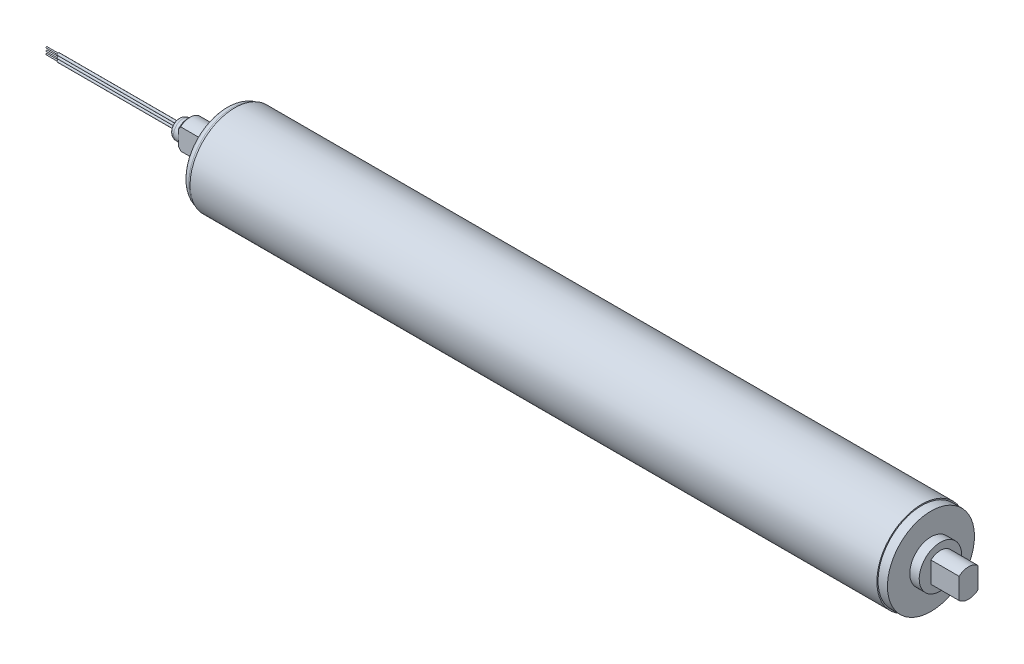
ISO-10303-21;
HEADER;
FILE_DESCRIPTION(('STEP AP214'),'2;1');
FILE_NAME('part.step','',(''),(''),'','','');
FILE_SCHEMA(('AUTOMOTIVE_DESIGN { 1 0 10303 214 1 1 1 1 }'));
ENDSEC;
DATA;
#1=APPLICATION_CONTEXT('core data for automotive mechanical design processes');
#2=APPLICATION_PROTOCOL_DEFINITION('international standard','automotive_design',2000,#1);
#3=PRODUCT_CONTEXT('',#1,'mechanical');
#4=PRODUCT('Part','Part','',(#3));
#5=PRODUCT_RELATED_PRODUCT_CATEGORY('part','',(#4));
#6=PRODUCT_DEFINITION_FORMATION('','',#4);
#7=PRODUCT_DEFINITION_CONTEXT('part definition',#1,'design');
#8=PRODUCT_DEFINITION('design','',#6,#7);
#9=PRODUCT_DEFINITION_SHAPE('','',#8);
#10=(LENGTH_UNIT() NAMED_UNIT(*) SI_UNIT(.MILLI.,.METRE.));
#11=(NAMED_UNIT(*) PLANE_ANGLE_UNIT() SI_UNIT($,.RADIAN.));
#12=(NAMED_UNIT(*) SI_UNIT($,.STERADIAN.) SOLID_ANGLE_UNIT());
#13=UNCERTAINTY_MEASURE_WITH_UNIT(LENGTH_MEASURE(1.E-05),#10,'distance_accuracy_value','');
#14=(GEOMETRIC_REPRESENTATION_CONTEXT(3) GLOBAL_UNCERTAINTY_ASSIGNED_CONTEXT((#13)) GLOBAL_UNIT_ASSIGNED_CONTEXT((#10,
#11,#12)) REPRESENTATION_CONTEXT('',''));
#15=CARTESIAN_POINT('',(0.,0.,0.));
#16=DIRECTION('',(0.,0.,1.));
#17=DIRECTION('',(1.,0.,0.));
#18=AXIS2_PLACEMENT_3D('',#15,#16,#17);
#19=CARTESIAN_POINT('',(-320.,1.99999999999995,0.));
#20=DIRECTION('',(1.,0.,0.));
#21=DIRECTION('',(0.,1.,0.));
#22=AXIS2_PLACEMENT_3D('',#19,#20,#21);
#23=PLANE('',#22);
#24=CARTESIAN_POINT('',(-320.,0.,0.));
#25=DIRECTION('',(1.,0.,0.));
#26=DIRECTION('',(0.,1.,0.));
#27=AXIS2_PLACEMENT_3D('',#24,#25,#26);
#28=CIRCLE('',#27,0.499999999999996);
#29=CARTESIAN_POINT('',(-320.,0.499999999999996,0.));
#30=VERTEX_POINT('',#29);
#31=EDGE_CURVE('E42',#30,#30,#28,.F.);
#32=ORIENTED_EDGE('',*,*,#31,.F.);
#33=EDGE_LOOP('',(#32));
#34=FACE_BOUND('',#33,.T.);
#35=CARTESIAN_POINT('',(-320.,0.,0.));
#36=DIRECTION('',(-1.,0.,0.));
#37=DIRECTION('',(0.,-1.,0.));
#38=AXIS2_PLACEMENT_3D('',#35,#36,#37);
#39=CIRCLE('',#38,1.99999999999999);
#40=CARTESIAN_POINT('',(-320.,-2.00000000000003,0.));
#41=VERTEX_POINT('',#40);
#42=EDGE_CURVE('E178',#41,#41,#39,.T.);
#43=ORIENTED_EDGE('',*,*,#42,.T.);
#44=EDGE_LOOP('',(#43));
#45=FACE_BOUND('',#44,.T.);
#46=CARTESIAN_POINT('',(-320.,1.25,0.));
#47=DIRECTION('',(1.,0.,0.));
#48=DIRECTION('',(0.,1.,0.));
#49=AXIS2_PLACEMENT_3D('',#46,#47,#48);
#50=CIRCLE('',#49,0.499999999999996);
#51=CARTESIAN_POINT('',(-320.,1.75,0.));
#52=VERTEX_POINT('',#51);
#53=EDGE_CURVE('E165',#52,#52,#50,.F.);
#54=ORIENTED_EDGE('',*,*,#53,.F.);
#55=EDGE_LOOP('',(#54));
#56=FACE_BOUND('',#55,.T.);
#57=CARTESIAN_POINT('',(-320.,-1.25,0.));
#58=DIRECTION('',(1.,0.,0.));
#59=DIRECTION('',(0.,1.,0.));
#60=AXIS2_PLACEMENT_3D('',#57,#58,#59);
#61=CIRCLE('',#60,0.499999999999996);
#62=CARTESIAN_POINT('',(-320.,-0.750000000000004,0.));
#63=VERTEX_POINT('',#62);
#64=EDGE_CURVE('E11',#63,#63,#61,.F.);
#65=ORIENTED_EDGE('',*,*,#64,.F.);
#66=EDGE_LOOP('',(#65));
#67=FACE_BOUND('',#66,.T.);
#68=ADVANCED_FACE('F34',(#34,#45,#56,#67),#23,.F.);
#69=CARTESIAN_POINT('',(-320.,0.,0.));
#70=DIRECTION('',(-1.,0.,0.));
#71=DIRECTION('',(0.,-1.,0.));
#72=AXIS2_PLACEMENT_3D('',#69,#70,#71);
#73=CYLINDRICAL_SURFACE('',#72,6.00000000000002);
#74=CARTESIAN_POINT('',(-304.,0.,0.));
#75=DIRECTION('',(-1.,0.,0.));
#76=DIRECTION('',(0.,-1.,0.));
#77=AXIS2_PLACEMENT_3D('',#74,#75,#76);
#78=CIRCLE('',#77,6.);
#79=CARTESIAN_POINT('',(-304.,4.47213595499958,4.));
#80=VERTEX_POINT('',#79);
#81=CARTESIAN_POINT('',(-304.,4.47213595499958,-4.));
#82=VERTEX_POINT('',#81);
#83=EDGE_CURVE('E135',#80,#82,#78,.T.);
#84=ORIENTED_EDGE('',*,*,#83,.T.);
#85=DIRECTION('',(1.,0.,0.));
#86=VECTOR('',#85,1.);
#87=CARTESIAN_POINT('',(-320.,4.47213595499958,-4.));
#88=LINE('',#87,#86);
#89=CARTESIAN_POINT('',(-315.,4.47213595499958,-4.));
#90=VERTEX_POINT('',#89);
#91=EDGE_CURVE('E116',#90,#82,#88,.T.);
#92=ORIENTED_EDGE('',*,*,#91,.F.);
#93=CARTESIAN_POINT('',(-315.,0.,0.));
#94=DIRECTION('',(-1.,0.,0.));
#95=DIRECTION('',(0.,-1.,0.));
#96=AXIS2_PLACEMENT_3D('',#93,#94,#95);
#97=CIRCLE('',#96,6.00000000000004);
#98=CARTESIAN_POINT('',(-315.,4.47213595499958,4.));
#99=VERTEX_POINT('',#98);
#100=EDGE_CURVE('E147',#99,#90,#97,.T.);
#101=ORIENTED_EDGE('',*,*,#100,.F.);
#102=DIRECTION('',(1.,0.,0.));
#103=VECTOR('',#102,1.);
#104=CARTESIAN_POINT('',(-320.,4.47213595499958,4.));
#105=LINE('',#104,#103);
#106=EDGE_CURVE('E141',#99,#80,#105,.T.);
#107=ORIENTED_EDGE('',*,*,#106,.T.);
#108=EDGE_LOOP('',(#84,#92,#101,#107));
#109=FACE_BOUND('',#108,.T.);
#110=ADVANCED_FACE('F140',(#109),#73,.T.);
#111=CARTESIAN_POINT('',(-315.,0.,0.));
#112=DIRECTION('',(1.,0.,0.));
#113=DIRECTION('',(0.,1.,0.));
#114=AXIS2_PLACEMENT_3D('',#111,#112,#113);
#115=CONICAL_SURFACE('',#114,6.00000000000004,0.785398163397447);
#116=ORIENTED_EDGE('',*,*,#100,.T.);
#117=CARTESIAN_POINT('',(-310.348097953493,9.87233595499958,-4.));
#118=CARTESIAN_POINT('',(-310.485785378819,9.72377348343692,-4.));
#119=CARTESIAN_POINT('',(-310.623239874139,9.57499522335075,-4.));
#120=CARTESIAN_POINT('',(-310.897611312588,9.27694197462675,-4.));
#121=CARTESIAN_POINT('',(-311.03452825187,9.12766698244784,-4.));
#122=CARTESIAN_POINT('',(-311.444420881254,8.6789381797191,-4.));
#123=CARTESIAN_POINT('',(-311.716479226026,8.37864424982853,-4.));
#124=CARTESIAN_POINT('',(-312.258938809483,7.7733078240898,-4.));
#125=CARTESIAN_POINT('',(-312.529320360041,7.46824765877185,-4.));
#126=CARTESIAN_POINT('',(-313.065469638492,6.85414443293827,-4.));
#127=CARTESIAN_POINT('',(-313.331237906682,6.54510184632325,-4.));
#128=CARTESIAN_POINT('',(-313.803360810391,5.9841173457233,-4.));
#129=CARTESIAN_POINT('',(-314.010916941523,5.73318855486564,-4.));
#130=CARTESIAN_POINT('',(-314.420204548364,5.2264858969519,-4.));
#131=CARTESIAN_POINT('',(-314.621934602828,4.97071087246411,-4.));
#132=CARTESIAN_POINT('',(-314.918011814869,4.58230530487928,-4.));
#133=CARTESIAN_POINT('',(-315.015565491153,4.45211995373227,-4.));
#134=CARTESIAN_POINT('',(-315.208049149313,4.18982728834047,-4.));
#135=CARTESIAN_POINT('',(-315.302979253318,4.05772006399873,-4.));
#136=CARTESIAN_POINT('',(-315.489572207938,3.79128641774824,-4.));
#137=CARTESIAN_POINT('',(-315.581236300737,3.65696086862227,-4.));
#138=CARTESIAN_POINT('',(-315.760514937465,3.3856428167139,-4.));
#139=CARTESIAN_POINT('',(-315.848129930081,3.24865061183029,-4.));
#140=CARTESIAN_POINT('',(-316.015519182035,2.97594748733124,-4.));
#141=CARTESIAN_POINT('',(-316.095454695564,2.84033607654962,-4.));
#142=CARTESIAN_POINT('',(-316.249245583246,2.5656617691129,-4.));
#143=CARTESIAN_POINT('',(-316.323100277988,2.4265984890332,-4.));
#144=CARTESIAN_POINT('',(-316.462978021251,2.1446544148718,-4.));
#145=CARTESIAN_POINT('',(-316.52900565023,2.00177591407493,-4.));
#146=CARTESIAN_POINT('',(-316.651094188096,1.71179903129537,-4.));
#147=CARTESIAN_POINT('',(-316.707157883482,1.56470184251146,-4.));
#148=CARTESIAN_POINT('',(-316.79583018373,1.29889069024594,-4.));
#149=CARTESIAN_POINT('',(-316.830887105527,1.18099820235914,-4.));
#150=CARTESIAN_POINT('',(-316.891976477118,0.942910289568662,-4.));
#151=CARTESIAN_POINT('',(-316.918012254946,0.822715731239105,-4.));
#152=CARTESIAN_POINT('',(-316.95978418083,0.580919177904211,-4.));
#153=CARTESIAN_POINT('',(-316.975552917641,0.459322895278734,-4.));
#154=CARTESIAN_POINT('',(-316.996061518468,0.215195276279694,-4.));
#155=CARTESIAN_POINT('',(-317.000802034447,0.0926639956109005,-4.));
#156=CARTESIAN_POINT('',(-316.998972969027,-0.15266500341693,-4.));
#157=CARTESIAN_POINT('',(-316.992370861094,-0.275462476113516,-4.));
#158=CARTESIAN_POINT('',(-316.968182630928,-0.519962037216906,-4.));
#159=CARTESIAN_POINT('',(-316.950595643883,-0.641664038614778,-4.));
#160=CARTESIAN_POINT('',(-316.905311822086,-0.883538707213671,-4.));
#161=CARTESIAN_POINT('',(-316.877583523375,-1.00370539703,-4.));
#162=CARTESIAN_POINT('',(-316.813294269151,-1.24162572814158,-4.));
#163=CARTESIAN_POINT('',(-316.776732891142,-1.35937925372016,-4.));
#164=CARTESIAN_POINT('',(-316.691726306715,-1.6049641892166,-4.));
#165=CARTESIAN_POINT('',(-316.642420143244,-1.73249503701986,-4.));
#166=CARTESIAN_POINT('',(-316.536283570465,-1.98439454647171,-4.));
#167=CARTESIAN_POINT('',(-316.479450898265,-2.108762243641,-4.));
#168=CARTESIAN_POINT('',(-316.359613165055,-2.35472823718913,-4.));
#169=CARTESIAN_POINT('',(-316.296597703961,-2.47632142809174,-4.));
#170=CARTESIAN_POINT('',(-316.165660945696,-2.71679999041975,-4.));
#171=CARTESIAN_POINT('',(-316.097740266632,-2.83568570054099,-4.));
#172=CARTESIAN_POINT('',(-315.95703802738,-3.07256584022871,-4.));
#173=CARTESIAN_POINT('',(-315.884205994157,-3.19053015423147,-4.));
#174=CARTESIAN_POINT('',(-315.735215251699,-3.42433305452737,-4.));
#175=CARTESIAN_POINT('',(-315.659056467137,-3.54017159260217,-4.));
#176=CARTESIAN_POINT('',(-315.426665623848,-3.88470236091064,-4.));
#177=CARTESIAN_POINT('',(-315.266371379636,-4.11065270672827,-4.));
#178=CARTESIAN_POINT('',(-314.916868510665,-4.58625466028655,-4.));
#179=CARTESIAN_POINT('',(-314.726622259177,-4.83513537016013,-4.));
#180=CARTESIAN_POINT('',(-314.339539499162,-5.32774668572103,-4.));
#181=CARTESIAN_POINT('',(-314.142702059476,-5.57147655573088,-4.));
#182=CARTESIAN_POINT('',(-313.744141258258,-6.05526810881872,-4.));
#183=CARTESIAN_POINT('',(-313.542413572822,-6.29532621500366,-4.));
#184=CARTESIAN_POINT('',(-313.135469383521,-6.77246895873478,-4.));
#185=CARTESIAN_POINT('',(-312.930252796717,-7.00955352536136,-4.));
#186=CARTESIAN_POINT('',(-312.529102237845,-7.46777293884806,-4.));
#187=CARTESIAN_POINT('',(-312.33331676996,-7.68903805930736,-4.));
#188=CARTESIAN_POINT('',(-311.939887131066,-8.12991575994878,-4.));
#189=CARTESIAN_POINT('',(-311.742242922958,-8.34952830698811,-4.));
#190=CARTESIAN_POINT('',(-311.345863079864,-8.7869746767676,-4.));
#191=CARTESIAN_POINT('',(-311.147130374716,-9.00481115748411,-4.));
#192=CARTESIAN_POINT('',(-310.748456983956,-9.4393588609609,-4.));
#193=CARTESIAN_POINT('',(-310.548516351365,-9.65607013234572,-4.));
#194=CARTESIAN_POINT('',(-310.348097953493,-9.87233595499961,-4.));
#195=B_SPLINE_CURVE_WITH_KNOTS('',3,(#117,#118,#119,#120,#121,#122,#123,#124,#125,#126,#127,
#128,#129,#130,#131,#132,#133,#134,#135,#136,#137,#138,#139,#140,#141,#142,#143,#144,#145,#146,
#147,#148,#149,#150,#151,#152,#153,#154,#155,#156,#157,#158,#159,#160,#161,#162,#163,#164,#165,
#166,#167,#168,#169,#170,#171,#172,#173,#174,#175,#176,#177,#178,#179,#180,#181,#182,#183,#184,
#185,#186,#187,#188,#189,#190,#191,#192,#193,#194),.UNSPECIFIED.,.F.,.F.,(4,2,2,2,2,2,2,2,2,2,2,
2,2,2,2,2,2,2,2,2,2,2,2,2,2,2,2,2,2,2,2,2,2,2,2,2,2,2,4),(0.,0.607665220149571,1.21533478151003,
2.43093470965799,3.6538162249376,4.87655353932171,5.85343455483657,6.83055189669215,
7.31856835727925,7.80656206195079,8.29436813923656,8.78212003171756,9.25424889039398,
9.72643042868088,10.198334264171,10.6701059193542,11.0387894286706,11.4073367799237,
11.7747085422478,12.1420585857882,12.5104638152255,12.8788980519096,13.2484852089585,
13.6180900472698,14.0279823313661,14.4379981331091,14.8487158494804,15.2593819011795,
15.6752235212237,16.0910745620532,16.9219246396934,17.8615746196885,18.8013579119533,
19.7420048615308,20.6826742032538,21.5690091260247,22.455361777351,23.3399623037883,
24.2245242797311),.UNSPECIFIED.);
#196=CARTESIAN_POINT('',(-316.,3.00000000000003,-4.));
#197=VERTEX_POINT('',#196);
#198=EDGE_CURVE('E122',#90,#197,#195,.T.);
#199=ORIENTED_EDGE('',*,*,#198,.T.);
#200=CARTESIAN_POINT('',(-316.,0.,0.));
#201=DIRECTION('',(-1.,0.,0.));
#202=DIRECTION('',(0.,-1.,0.));
#203=AXIS2_PLACEMENT_3D('',#200,#201,#202);
#204=CIRCLE('',#203,5.00000000000004);
#205=CARTESIAN_POINT('',(-316.,3.00000000000003,4.));
#206=VERTEX_POINT('',#205);
#207=EDGE_CURVE('E327',#206,#197,#204,.T.);
#208=ORIENTED_EDGE('',*,*,#207,.F.);
#209=CARTESIAN_POINT('',(-310.348097953493,-9.87233595499959,4.));
#210=CARTESIAN_POINT('',(-310.485785378819,-9.72377348343692,4.));
#211=CARTESIAN_POINT('',(-310.623239874139,-9.57499522335075,4.));
#212=CARTESIAN_POINT('',(-310.897611312588,-9.27694197462674,4.));
#213=CARTESIAN_POINT('',(-311.034528251871,-9.12766698244783,4.));
#214=CARTESIAN_POINT('',(-311.444420881254,-8.67893817971909,4.));
#215=CARTESIAN_POINT('',(-311.716479226026,-8.37864424982854,4.));
#216=CARTESIAN_POINT('',(-312.258938809483,-7.77330782408983,4.));
#217=CARTESIAN_POINT('',(-312.529320360041,-7.46824765877189,4.));
#218=CARTESIAN_POINT('',(-313.065469638492,-6.85414443293833,4.));
#219=CARTESIAN_POINT('',(-313.331237906682,-6.54510184632333,4.));
#220=CARTESIAN_POINT('',(-313.803360810391,-5.98411734572339,4.));
#221=CARTESIAN_POINT('',(-314.010916941523,-5.73318855486575,4.));
#222=CARTESIAN_POINT('',(-314.420204548364,-5.22648589695202,4.));
#223=CARTESIAN_POINT('',(-314.621934602828,-4.97071087246424,4.));
#224=CARTESIAN_POINT('',(-314.918011814869,-4.58230530487944,4.));
#225=CARTESIAN_POINT('',(-315.015565491153,-4.45211995373245,4.));
#226=CARTESIAN_POINT('',(-315.208049149313,-4.18982728834065,4.));
#227=CARTESIAN_POINT('',(-315.302979253318,-4.05772006399889,4.));
#228=CARTESIAN_POINT('',(-315.489572207938,-3.79128641774839,4.));
#229=CARTESIAN_POINT('',(-315.581236300737,-3.65696086862242,4.));
#230=CARTESIAN_POINT('',(-315.760514937465,-3.38564281671408,4.));
#231=CARTESIAN_POINT('',(-315.848129930081,-3.24865061183049,4.));
#232=CARTESIAN_POINT('',(-316.015519182035,-2.97594748733145,4.));
#233=CARTESIAN_POINT('',(-316.095454695564,-2.84033607654982,4.));
#234=CARTESIAN_POINT('',(-316.249245583246,-2.56566176911308,4.));
#235=CARTESIAN_POINT('',(-316.323100277988,-2.42659848903338,4.));
#236=CARTESIAN_POINT('',(-316.462978021251,-2.14465441487197,4.));
#237=CARTESIAN_POINT('',(-316.52900565023,-2.0017759140751,4.));
#238=CARTESIAN_POINT('',(-316.651094188096,-1.71179903129554,4.));
#239=CARTESIAN_POINT('',(-316.707157883482,-1.56470184251163,4.));
#240=CARTESIAN_POINT('',(-316.79583018373,-1.29889069024609,4.));
#241=CARTESIAN_POINT('',(-316.830887105527,-1.18099820235928,4.));
#242=CARTESIAN_POINT('',(-316.891976477118,-0.942910289568792,4.));
#243=CARTESIAN_POINT('',(-316.918012254946,-0.822715731239243,4.));
#244=CARTESIAN_POINT('',(-316.95978418083,-0.58091917790435,4.));
#245=CARTESIAN_POINT('',(-316.975552917641,-0.459322895278868,4.));
#246=CARTESIAN_POINT('',(-316.996061518468,-0.215195276279822,4.));
#247=CARTESIAN_POINT('',(-317.000802034447,-0.092663995611029,4.));
#248=CARTESIAN_POINT('',(-316.998972969027,0.152665003416807,4.));
#249=CARTESIAN_POINT('',(-316.992370861094,0.275462476113399,4.));
#250=CARTESIAN_POINT('',(-316.968182630928,0.519962037216799,4.));
#251=CARTESIAN_POINT('',(-316.950595643883,0.641664038614674,4.));
#252=CARTESIAN_POINT('',(-316.905311822086,0.883538707213571,4.));
#253=CARTESIAN_POINT('',(-316.877583523375,1.00370539702991,4.));
#254=CARTESIAN_POINT('',(-316.813294269151,1.24162572814148,4.));
#255=CARTESIAN_POINT('',(-316.776732891142,1.35937925372006,4.));
#256=CARTESIAN_POINT('',(-316.691726306715,1.60496418921649,4.));
#257=CARTESIAN_POINT('',(-316.642420143244,1.73249503701976,4.));
#258=CARTESIAN_POINT('',(-316.536283570465,1.9843945464716,4.));
#259=CARTESIAN_POINT('',(-316.479450898265,2.10876224364087,4.));
#260=CARTESIAN_POINT('',(-316.359613165055,2.354728237189,4.));
#261=CARTESIAN_POINT('',(-316.296597703961,2.47632142809162,4.));
#262=CARTESIAN_POINT('',(-316.165660945696,2.71679999041964,4.));
#263=CARTESIAN_POINT('',(-316.097740266632,2.83568570054086,4.));
#264=CARTESIAN_POINT('',(-315.95703802738,3.07256584022856,4.));
#265=CARTESIAN_POINT('',(-315.884205994157,3.19053015423132,4.));
#266=CARTESIAN_POINT('',(-315.7352152517,3.42433305452722,4.));
#267=CARTESIAN_POINT('',(-315.659056467137,3.54017159260201,4.));
#268=CARTESIAN_POINT('',(-315.426665623848,3.88470236091049,4.));
#269=CARTESIAN_POINT('',(-315.266371379636,4.11065270672812,4.));
#270=CARTESIAN_POINT('',(-314.916868510665,4.58625466028642,4.));
#271=CARTESIAN_POINT('',(-314.726622259177,4.83513537016002,4.));
#272=CARTESIAN_POINT('',(-314.339539499162,5.32774668572093,4.));
#273=CARTESIAN_POINT('',(-314.142702059476,5.57147655573078,4.));
#274=CARTESIAN_POINT('',(-313.744141258258,6.05526810881863,4.));
#275=CARTESIAN_POINT('',(-313.542413572822,6.29532621500357,4.));
#276=CARTESIAN_POINT('',(-313.135469383521,6.7724689587347,4.));
#277=CARTESIAN_POINT('',(-312.930252796717,7.00955352536128,4.));
#278=CARTESIAN_POINT('',(-312.529102237845,7.46777293884798,4.));
#279=CARTESIAN_POINT('',(-312.33331676996,7.68903805930726,4.));
#280=CARTESIAN_POINT('',(-311.939887131066,8.12991575994868,4.));
#281=CARTESIAN_POINT('',(-311.742242922958,8.34952830698803,4.));
#282=CARTESIAN_POINT('',(-311.345863079864,8.78697467676753,4.));
#283=CARTESIAN_POINT('',(-311.147130374716,9.00481115748405,4.));
#284=CARTESIAN_POINT('',(-310.748456983956,9.43935886096085,4.));
#285=CARTESIAN_POINT('',(-310.548516351365,9.65607013234566,4.));
#286=CARTESIAN_POINT('',(-310.348097953493,9.87233595499956,4.));
#287=B_SPLINE_CURVE_WITH_KNOTS('',3,(#209,#210,#211,#212,#213,#214,#215,#216,#217,#218,#219,
#220,#221,#222,#223,#224,#225,#226,#227,#228,#229,#230,#231,#232,#233,#234,#235,#236,#237,#238,
#239,#240,#241,#242,#243,#244,#245,#246,#247,#248,#249,#250,#251,#252,#253,#254,#255,#256,#257,
#258,#259,#260,#261,#262,#263,#264,#265,#266,#267,#268,#269,#270,#271,#272,#273,#274,#275,#276,
#277,#278,#279,#280,#281,#282,#283,#284,#285,#286),.UNSPECIFIED.,.F.,.F.,(4,2,2,2,2,2,2,2,2,2,2,
2,2,2,2,2,2,2,2,2,2,2,2,2,2,2,2,2,2,2,2,2,2,2,2,2,2,2,4),(0.,0.607665220149575,1.2153347815101,
2.43093470965798,3.65381622493752,4.87655353932163,5.85343455483642,6.83055189669197,
7.31856835727904,7.8065620619506,8.29436813923638,8.78212003171732,9.25424889039377,
9.72643042868069,10.1983342641708,10.6701059193541,11.0387894286705,11.4073367799236,
11.7747085422476,12.142058585788,12.5104638152254,12.8788980519095,13.2484852089584,
13.6180900472697,14.0279823313659,14.437998133109,14.8487158494802,15.2593819011794,
15.6752235212235,16.091074562053,16.9219246396932,17.8615746196884,18.8013579119531,
19.7420048615307,20.6826742032537,21.5690091260246,22.455361777351,23.3399623037882,
24.224524279731),.UNSPECIFIED.);
#288=EDGE_CURVE('E57',#206,#99,#287,.T.);
#289=ORIENTED_EDGE('',*,*,#288,.T.);
#290=EDGE_LOOP('',(#116,#199,#208,#289));
#291=FACE_BOUND('',#290,.T.);
#292=ADVANCED_FACE('F259',(#291),#115,.T.);
#293=CARTESIAN_POINT('',(-316.,5.,0.));
#294=DIRECTION('',(1.,0.,0.));
#295=DIRECTION('',(0.,1.,0.));
#296=AXIS2_PLACEMENT_3D('',#293,#294,#295);
#297=PLANE('',#296);
#298=ORIENTED_EDGE('',*,*,#207,.T.);
#299=DIRECTION('',(0.,-1.,0.));
#300=VECTOR('',#299,1.);
#301=CARTESIAN_POINT('',(-316.,5.,-4.));
#302=LINE('',#301,#300);
#303=CARTESIAN_POINT('',(-316.,0.,-4.));
#304=VERTEX_POINT('',#303);
#305=EDGE_CURVE('E247',#197,#304,#302,.T.);
#306=ORIENTED_EDGE('',*,*,#305,.T.);
#307=CARTESIAN_POINT('',(-316.,0.,0.));
#308=DIRECTION('',(-1.,0.,0.));
#309=DIRECTION('',(0.,-1.,0.));
#310=AXIS2_PLACEMENT_3D('',#307,#308,#309);
#311=CIRCLE('',#310,4.);
#312=CARTESIAN_POINT('',(-316.,0.,4.));
#313=VERTEX_POINT('',#312);
#314=EDGE_CURVE('E324',#313,#304,#311,.T.);
#315=ORIENTED_EDGE('',*,*,#314,.F.);
#316=DIRECTION('',(0.,1.,0.));
#317=VECTOR('',#316,1.);
#318=CARTESIAN_POINT('',(-316.,5.,4.));
#319=LINE('',#318,#317);
#320=EDGE_CURVE('E270',#313,#206,#319,.T.);
#321=ORIENTED_EDGE('',*,*,#320,.T.);
#322=EDGE_LOOP('',(#298,#306,#315,#321));
#323=FACE_BOUND('',#322,.T.);
#324=ADVANCED_FACE('F389',(#323),#297,.F.);
#325=CARTESIAN_POINT('',(16.,6.,0.));
#326=DIRECTION('',(-1.,0.,0.));
#327=DIRECTION('',(0.,-1.,0.));
#328=AXIS2_PLACEMENT_3D('',#325,#326,#327);
#329=PLANE('',#328);
#330=DIRECTION('',(0.,-1.,0.));
#331=VECTOR('',#330,1.);
#332=CARTESIAN_POINT('',(16.,4.47213595499958,-4.));
#333=LINE('',#332,#331);
#334=CARTESIAN_POINT('',(16.,4.47213595499958,-4.));
#335=VERTEX_POINT('',#334);
#336=CARTESIAN_POINT('',(16.,-4.47213595499958,-4.));
#337=VERTEX_POINT('',#336);
#338=EDGE_CURVE('E273',#335,#337,#333,.T.);
#339=ORIENTED_EDGE('',*,*,#338,.F.);
#340=CARTESIAN_POINT('',(16.,0.,0.));
#341=DIRECTION('',(-1.,0.,0.));
#342=DIRECTION('',(0.,-1.,0.));
#343=AXIS2_PLACEMENT_3D('',#340,#341,#342);
#344=CIRCLE('',#343,6.00000000000002);
#345=CARTESIAN_POINT('',(16.,4.47213595499958,4.));
#346=VERTEX_POINT('',#345);
#347=EDGE_CURVE('E316',#346,#335,#344,.T.);
#348=ORIENTED_EDGE('',*,*,#347,.F.);
#349=DIRECTION('',(0.,1.,0.));
#350=VECTOR('',#349,1.);
#351=CARTESIAN_POINT('',(16.,4.47213595499958,4.));
#352=LINE('',#351,#350);
#353=CARTESIAN_POINT('',(16.,-4.47213595499958,4.));
#354=VERTEX_POINT('',#353);
#355=EDGE_CURVE('E284',#354,#346,#352,.T.);
#356=ORIENTED_EDGE('',*,*,#355,.F.);
#357=EDGE_CURVE('E315',#337,#354,#344,.T.);
#358=ORIENTED_EDGE('',*,*,#357,.F.);
#359=EDGE_LOOP('',(#339,#348,#356,#358));
#360=FACE_BOUND('',#359,.T.);
#361=ADVANCED_FACE('F404',(#360),#329,.F.);
#362=CARTESIAN_POINT('',(-320.,0.,0.));
#363=DIRECTION('',(-1.,0.,0.));
#364=DIRECTION('',(0.,-1.,0.));
#365=AXIS2_PLACEMENT_3D('',#362,#363,#364);
#366=CYLINDRICAL_SURFACE('',#365,6.00000000000002);
#367=DIRECTION('',(-1.,0.,0.));
#368=VECTOR('',#367,1.);
#369=CARTESIAN_POINT('',(16.,-4.47213595499958,-4.));
#370=LINE('',#369,#368);
#371=CARTESIAN_POINT('',(4.,-4.47213595499962,-4.));
#372=VERTEX_POINT('',#371);
#373=EDGE_CURVE('E275',#337,#372,#370,.T.);
#374=ORIENTED_EDGE('',*,*,#373,.F.);
#375=ORIENTED_EDGE('',*,*,#357,.T.);
#376=DIRECTION('',(-1.,0.,0.));
#377=VECTOR('',#376,1.);
#378=CARTESIAN_POINT('',(16.,-4.47213595499958,4.));
#379=LINE('',#378,#377);
#380=CARTESIAN_POINT('',(4.,-4.47213595499958,4.));
#381=VERTEX_POINT('',#380);
#382=EDGE_CURVE('E290',#354,#381,#379,.T.);
#383=ORIENTED_EDGE('',*,*,#382,.T.);
#384=CARTESIAN_POINT('',(4.,0.,0.));
#385=DIRECTION('',(-1.,0.,0.));
#386=DIRECTION('',(0.,-1.,0.));
#387=AXIS2_PLACEMENT_3D('',#384,#385,#386);
#388=CIRCLE('',#387,6.00000000000002);
#389=EDGE_CURVE('E311',#372,#381,#388,.T.);
#390=ORIENTED_EDGE('',*,*,#389,.F.);
#391=EDGE_LOOP('',(#374,#375,#383,#390));
#392=FACE_BOUND('',#391,.T.);
#393=ADVANCED_FACE('F407',(#392),#366,.T.);
#394=DIRECTION('',(-1.,0.,0.));
#395=VECTOR('',#394,1.);
#396=CARTESIAN_POINT('',(16.,4.47213595499958,-4.));
#397=LINE('',#396,#395);
#398=CARTESIAN_POINT('',(4.,4.47213595499958,-4.));
#399=VERTEX_POINT('',#398);
#400=EDGE_CURVE('E280',#335,#399,#397,.T.);
#401=ORIENTED_EDGE('',*,*,#400,.T.);
#402=CARTESIAN_POINT('',(4.,4.47213595499959,4.));
#403=VERTEX_POINT('',#402);
#404=EDGE_CURVE('E312',#403,#399,#388,.T.);
#405=ORIENTED_EDGE('',*,*,#404,.F.);
#406=DIRECTION('',(-1.,0.,0.));
#407=VECTOR('',#406,1.);
#408=CARTESIAN_POINT('',(16.,4.47213595499958,4.));
#409=LINE('',#408,#407);
#410=EDGE_CURVE('E286',#346,#403,#409,.T.);
#411=ORIENTED_EDGE('',*,*,#410,.F.);
#412=ORIENTED_EDGE('',*,*,#347,.T.);
#413=EDGE_LOOP('',(#401,#405,#411,#412));
#414=FACE_BOUND('',#413,.T.);
#415=ADVANCED_FACE('F411',(#414),#366,.T.);
#416=CARTESIAN_POINT('',(-296.,19.,0.));
#417=DIRECTION('',(1.,0.,0.));
#418=DIRECTION('',(0.,1.,0.));
#419=AXIS2_PLACEMENT_3D('',#416,#417,#418);
#420=PLANE('',#419);
#421=CARTESIAN_POINT('',(-296.,0.,0.));
#422=DIRECTION('',(-1.,0.,0.));
#423=DIRECTION('',(0.,-1.,0.));
#424=AXIS2_PLACEMENT_3D('',#421,#422,#423);
#425=CIRCLE('',#424,18.5);
#426=CARTESIAN_POINT('',(-296.,-18.5,0.));
#427=VERTEX_POINT('',#426);
#428=EDGE_CURVE('E162',#427,#427,#425,.T.);
#429=ORIENTED_EDGE('',*,*,#428,.F.);
#430=EDGE_LOOP('',(#429));
#431=FACE_BOUND('',#430,.T.);
#432=CARTESIAN_POINT('',(-296.,0.,0.));
#433=DIRECTION('',(-1.,0.,0.));
#434=DIRECTION('',(0.,-1.,0.));
#435=AXIS2_PLACEMENT_3D('',#432,#433,#434);
#436=CIRCLE('',#435,19.);
#437=CARTESIAN_POINT('',(-296.,-19.0000000000001,0.));
#438=VERTEX_POINT('',#437);
#439=EDGE_CURVE('E293',#438,#438,#436,.T.);
#440=ORIENTED_EDGE('',*,*,#439,.T.);
#441=EDGE_LOOP('',(#440));
#442=FACE_BOUND('',#441,.T.);
#443=ADVANCED_FACE('F36',(#431,#442),#420,.F.);
#444=CARTESIAN_POINT('',(-320.,0.,0.));
#445=DIRECTION('',(-1.,0.,0.));
#446=DIRECTION('',(0.,-1.,0.));
#447=AXIS2_PLACEMENT_3D('',#444,#445,#446);
#448=CYLINDRICAL_SURFACE('',#447,18.5);
#449=CARTESIAN_POINT('',(-297.,0.,0.));
#450=DIRECTION('',(-1.,0.,0.));
#451=DIRECTION('',(0.,-1.,0.));
#452=AXIS2_PLACEMENT_3D('',#449,#450,#451);
#453=CIRCLE('',#452,18.5);
#454=CARTESIAN_POINT('',(-297.,-18.5,0.));
#455=VERTEX_POINT('',#454);
#456=EDGE_CURVE('E159',#455,#455,#453,.T.);
#457=ORIENTED_EDGE('',*,*,#456,.F.);
#458=EDGE_LOOP('',(#457));
#459=FACE_BOUND('',#458,.T.);
#460=ORIENTED_EDGE('',*,*,#428,.T.);
#461=EDGE_LOOP('',(#460));
#462=FACE_BOUND('',#461,.T.);
#463=ADVANCED_FACE('F461',(#459,#462),#448,.T.);
#464=CARTESIAN_POINT('',(-297.,0.,0.));
#465=DIRECTION('',(-1.,0.,0.));
#466=DIRECTION('',(0.,-1.,0.));
#467=AXIS2_PLACEMENT_3D('',#464,#465,#466);
#468=TOROIDAL_SURFACE('',#467,15.5,3.);
#469=CARTESIAN_POINT('',(-300.,0.,0.));
#470=DIRECTION('',(-1.,0.,0.));
#471=DIRECTION('',(0.,-1.,0.));
#472=AXIS2_PLACEMENT_3D('',#469,#470,#471);
#473=CIRCLE('',#472,15.5);
#474=CARTESIAN_POINT('',(-300.,-15.5,0.));
#475=VERTEX_POINT('',#474);
#476=EDGE_CURVE('E156',#475,#475,#473,.T.);
#477=ORIENTED_EDGE('',*,*,#476,.F.);
#478=EDGE_LOOP('',(#477));
#479=FACE_BOUND('',#478,.T.);
#480=ORIENTED_EDGE('',*,*,#456,.T.);
#481=EDGE_LOOP('',(#480));
#482=FACE_BOUND('',#481,.T.);
#483=ADVANCED_FACE('F466',(#479,#482),#468,.T.);
#484=CARTESIAN_POINT('',(-300.,15.4999999999999,0.));
#485=DIRECTION('',(1.,0.,0.));
#486=DIRECTION('',(0.,1.,0.));
#487=AXIS2_PLACEMENT_3D('',#484,#485,#486);
#488=PLANE('',#487);
#489=CARTESIAN_POINT('',(-300.,0.,0.));
#490=DIRECTION('',(-1.,0.,0.));
#491=DIRECTION('',(0.,-1.,0.));
#492=AXIS2_PLACEMENT_3D('',#489,#490,#491);
#493=CIRCLE('',#492,9.);
#494=CARTESIAN_POINT('',(-300.,-9.00000000000004,0.));
#495=VERTEX_POINT('',#494);
#496=EDGE_CURVE('E153',#495,#495,#493,.T.);
#497=ORIENTED_EDGE('',*,*,#496,.F.);
#498=EDGE_LOOP('',(#497));
#499=FACE_BOUND('',#498,.T.);
#500=ORIENTED_EDGE('',*,*,#476,.T.);
#501=EDGE_LOOP('',(#500));
#502=FACE_BOUND('',#501,.T.);
#503=ADVANCED_FACE('F485',(#499,#502),#488,.F.);
#504=CARTESIAN_POINT('',(-320.,0.,0.));
#505=DIRECTION('',(-1.,0.,0.));
#506=DIRECTION('',(0.,-1.,0.));
#507=AXIS2_PLACEMENT_3D('',#504,#505,#506);
#508=CYLINDRICAL_SURFACE('',#507,9.);
#509=CARTESIAN_POINT('',(-303.2,0.,0.));
#510=DIRECTION('',(-1.,0.,0.));
#511=DIRECTION('',(0.,-1.,0.));
#512=AXIS2_PLACEMENT_3D('',#509,#510,#511);
#513=CIRCLE('',#512,9.);
#514=CARTESIAN_POINT('',(-303.2,-9.00000000000004,0.));
#515=VERTEX_POINT('',#514);
#516=EDGE_CURVE('E145',#515,#515,#513,.T.);
#517=ORIENTED_EDGE('',*,*,#516,.F.);
#518=EDGE_LOOP('',(#517));
#519=FACE_BOUND('',#518,.T.);
#520=ORIENTED_EDGE('',*,*,#496,.T.);
#521=EDGE_LOOP('',(#520));
#522=FACE_BOUND('',#521,.T.);
#523=ADVANCED_FACE('F492',(#519,#522),#508,.T.);
#524=CARTESIAN_POINT('',(-303.2,0.,0.));
#525=DIRECTION('',(1.,0.,0.));
#526=DIRECTION('',(0.,1.,0.));
#527=AXIS2_PLACEMENT_3D('',#524,#525,#526);
#528=CONICAL_SURFACE('',#527,9.,0.785398163397434);
#529=CARTESIAN_POINT('',(-304.,0.,0.));
#530=DIRECTION('',(-1.,0.,0.));
#531=DIRECTION('',(0.,-1.,0.));
#532=AXIS2_PLACEMENT_3D('',#529,#530,#531);
#533=CIRCLE('',#532,8.2);
#534=CARTESIAN_POINT('',(-304.,-8.20000000000004,0.));
#535=VERTEX_POINT('',#534);
#536=EDGE_CURVE('E142',#535,#535,#533,.T.);
#537=ORIENTED_EDGE('',*,*,#536,.F.);
#538=EDGE_LOOP('',(#537));
#539=FACE_BOUND('',#538,.T.);
#540=ORIENTED_EDGE('',*,*,#516,.T.);
#541=EDGE_LOOP('',(#540));
#542=FACE_BOUND('',#541,.T.);
#543=ADVANCED_FACE('F496',(#539,#542),#528,.T.);
#544=CARTESIAN_POINT('',(-304.,8.19999999999996,0.));
#545=DIRECTION('',(1.,0.,0.));
#546=DIRECTION('',(0.,1.,0.));
#547=AXIS2_PLACEMENT_3D('',#544,#545,#546);
#548=PLANE('',#547);
#549=ORIENTED_EDGE('',*,*,#83,.F.);
#550=DIRECTION('',(0.,1.,0.));
#551=VECTOR('',#550,1.);
#552=CARTESIAN_POINT('',(-304.,4.47213595499958,4.));
#553=LINE('',#552,#551);
#554=CARTESIAN_POINT('',(-304.,-4.47213595499958,4.));
#555=VERTEX_POINT('',#554);
#556=EDGE_CURVE('E249',#555,#80,#553,.T.);
#557=ORIENTED_EDGE('',*,*,#556,.F.);
#558=CARTESIAN_POINT('',(-304.,-4.47213595499958,-4.));
#559=VERTEX_POINT('',#558);
#560=EDGE_CURVE('E136',#559,#555,#78,.T.);
#561=ORIENTED_EDGE('',*,*,#560,.F.);
#562=DIRECTION('',(0.,-1.,0.));
#563=VECTOR('',#562,1.);
#564=CARTESIAN_POINT('',(-304.,4.47213595499958,-4.));
#565=LINE('',#564,#563);
#566=EDGE_CURVE('E119',#82,#559,#565,.T.);
#567=ORIENTED_EDGE('',*,*,#566,.F.);
#568=EDGE_LOOP('',(#549,#557,#561,#567));
#569=FACE_BOUND('',#568,.T.);
#570=ORIENTED_EDGE('',*,*,#536,.T.);
#571=EDGE_LOOP('',(#570));
#572=FACE_BOUND('',#571,.T.);
#573=ADVANCED_FACE('F132',(#569,#572),#548,.F.);
#574=CARTESIAN_POINT('',(-315.,-4.47213595499958,-4.));
#575=VERTEX_POINT('',#574);
#576=CARTESIAN_POINT('',(-315.,-4.47213595499958,4.));
#577=VERTEX_POINT('',#576);
#578=EDGE_CURVE('E329',#575,#577,#97,.T.);
#579=ORIENTED_EDGE('',*,*,#578,.F.);
#580=DIRECTION('',(1.,0.,0.));
#581=VECTOR('',#580,1.);
#582=CARTESIAN_POINT('',(-320.,-4.47213595499958,-4.));
#583=LINE('',#582,#581);
#584=EDGE_CURVE('E127',#575,#559,#583,.T.);
#585=ORIENTED_EDGE('',*,*,#584,.T.);
#586=ORIENTED_EDGE('',*,*,#560,.T.);
#587=DIRECTION('',(1.,0.,0.));
#588=VECTOR('',#587,1.);
#589=CARTESIAN_POINT('',(-320.,-4.47213595499958,4.));
#590=LINE('',#589,#588);
#591=EDGE_CURVE('E345',#577,#555,#590,.T.);
#592=ORIENTED_EDGE('',*,*,#591,.F.);
#593=EDGE_LOOP('',(#579,#585,#586,#592));
#594=FACE_BOUND('',#593,.T.);
#595=ADVANCED_FACE('F257',(#594),#73,.T.);
#596=CARTESIAN_POINT('',(-316.,-3.00000000000011,-4.));
#597=VERTEX_POINT('',#596);
#598=CARTESIAN_POINT('',(-316.,-3.00000000000011,4.));
#599=VERTEX_POINT('',#598);
#600=EDGE_CURVE('E326',#597,#599,#204,.T.);
#601=ORIENTED_EDGE('',*,*,#600,.F.);
#602=EDGE_CURVE('E49',#597,#575,#195,.T.);
#603=ORIENTED_EDGE('',*,*,#602,.T.);
#604=ORIENTED_EDGE('',*,*,#578,.T.);
#605=EDGE_CURVE('E271',#577,#599,#287,.T.);
#606=ORIENTED_EDGE('',*,*,#605,.T.);
#607=EDGE_LOOP('',(#601,#603,#604,#606));
#608=FACE_BOUND('',#607,.T.);
#609=ADVANCED_FACE('F251',(#608),#115,.T.);
#610=EDGE_CURVE('E323',#304,#313,#311,.T.);
#611=ORIENTED_EDGE('',*,*,#610,.F.);
#612=EDGE_CURVE('E248',#304,#597,#302,.T.);
#613=ORIENTED_EDGE('',*,*,#612,.T.);
#614=ORIENTED_EDGE('',*,*,#600,.T.);
#615=EDGE_CURVE('E269',#599,#313,#319,.T.);
#616=ORIENTED_EDGE('',*,*,#615,.T.);
#617=EDGE_LOOP('',(#611,#613,#614,#616));
#618=FACE_BOUND('',#617,.T.);
#619=ADVANCED_FACE('F256',(#618),#297,.F.);
#620=CARTESIAN_POINT('',(-320.,0.,0.));
#621=DIRECTION('',(-1.,0.,0.));
#622=DIRECTION('',(0.,-1.,0.));
#623=AXIS2_PLACEMENT_3D('',#620,#621,#622);
#624=CYLINDRICAL_SURFACE('',#623,4.);
#625=CARTESIAN_POINT('',(-318.,0.,0.));
#626=DIRECTION('',(-1.,0.,0.));
#627=DIRECTION('',(0.,-1.,0.));
#628=AXIS2_PLACEMENT_3D('',#625,#626,#627);
#629=CIRCLE('',#628,4.);
#630=CARTESIAN_POINT('',(-318.,-4.00000000000004,0.));
#631=VERTEX_POINT('',#630);
#632=EDGE_CURVE('E320',#631,#631,#629,.T.);
#633=ORIENTED_EDGE('',*,*,#632,.F.);
#634=EDGE_LOOP('',(#633));
#635=FACE_BOUND('',#634,.T.);
#636=ORIENTED_EDGE('',*,*,#314,.T.);
#637=ORIENTED_EDGE('',*,*,#610,.T.);
#638=EDGE_LOOP('',(#636,#637));
#639=FACE_BOUND('',#638,.T.);
#640=ADVANCED_FACE('F391',(#635,#639),#624,.T.);
#641=CARTESIAN_POINT('',(-318.,0.,0.));
#642=DIRECTION('',(-1.,0.,0.));
#643=DIRECTION('',(0.,-1.,0.));
#644=AXIS2_PLACEMENT_3D('',#641,#642,#643);
#645=TOROIDAL_SURFACE('',#644,2.,2.);
#646=ORIENTED_EDGE('',*,*,#42,.F.);
#647=EDGE_LOOP('',(#646));
#648=FACE_BOUND('',#647,.T.);
#649=ORIENTED_EDGE('',*,*,#632,.T.);
#650=EDGE_LOOP('',(#649));
#651=FACE_BOUND('',#650,.T.);
#652=ADVANCED_FACE('F393',(#648,#651),#645,.T.);
#653=CARTESIAN_POINT('',(4.,9.,0.));
#654=DIRECTION('',(-1.,0.,0.));
#655=DIRECTION('',(0.,-1.,0.));
#656=AXIS2_PLACEMENT_3D('',#653,#654,#655);
#657=PLANE('',#656);
#658=CARTESIAN_POINT('',(4.,0.,0.));
#659=DIRECTION('',(-1.,0.,0.));
#660=DIRECTION('',(0.,-1.,0.));
#661=AXIS2_PLACEMENT_3D('',#658,#659,#660);
#662=CIRCLE('',#661,9.00000000000001);
#663=CARTESIAN_POINT('',(4.,-9.00000000000003,0.));
#664=VERTEX_POINT('',#663);
#665=EDGE_CURVE('E308',#664,#664,#662,.T.);
#666=ORIENTED_EDGE('',*,*,#665,.F.);
#667=EDGE_LOOP('',(#666));
#668=FACE_BOUND('',#667,.T.);
#669=ORIENTED_EDGE('',*,*,#404,.T.);
#670=DIRECTION('',(0.,-1.,0.));
#671=VECTOR('',#670,1.);
#672=CARTESIAN_POINT('',(4.,4.47213595499958,-4.));
#673=LINE('',#672,#671);
#674=EDGE_CURVE('E276',#399,#372,#673,.T.);
#675=ORIENTED_EDGE('',*,*,#674,.T.);
#676=ORIENTED_EDGE('',*,*,#389,.T.);
#677=DIRECTION('',(0.,1.,0.));
#678=VECTOR('',#677,1.);
#679=CARTESIAN_POINT('',(4.,4.47213595499958,4.));
#680=LINE('',#679,#678);
#681=EDGE_CURVE('E283',#381,#403,#680,.T.);
#682=ORIENTED_EDGE('',*,*,#681,.T.);
#683=EDGE_LOOP('',(#669,#675,#676,#682));
#684=FACE_BOUND('',#683,.T.);
#685=ADVANCED_FACE('F399',(#668,#684),#657,.F.);
#686=CARTESIAN_POINT('',(-320.,0.,0.));
#687=DIRECTION('',(-1.,0.,0.));
#688=DIRECTION('',(0.,-1.,0.));
#689=AXIS2_PLACEMENT_3D('',#686,#687,#688);
#690=CYLINDRICAL_SURFACE('',#689,9.00000000000001);
#691=CARTESIAN_POINT('',(0.,0.,0.));
#692=DIRECTION('',(-1.,0.,0.));
#693=DIRECTION('',(0.,-1.,0.));
#694=AXIS2_PLACEMENT_3D('',#691,#692,#693);
#695=CIRCLE('',#694,9.00000000000002);
#696=CARTESIAN_POINT('',(0.,-9.00000000000003,0.));
#697=VERTEX_POINT('',#696);
#698=EDGE_CURVE('E305',#697,#697,#695,.T.);
#699=ORIENTED_EDGE('',*,*,#698,.F.);
#700=EDGE_LOOP('',(#699));
#701=FACE_BOUND('',#700,.T.);
#702=ORIENTED_EDGE('',*,*,#665,.T.);
#703=EDGE_LOOP('',(#702));
#704=FACE_BOUND('',#703,.T.);
#705=ADVANCED_FACE('F415',(#701,#704),#690,.T.);
#706=CARTESIAN_POINT('',(0.,18.5,0.));
#707=DIRECTION('',(-1.,0.,0.));
#708=DIRECTION('',(0.,-1.,0.));
#709=AXIS2_PLACEMENT_3D('',#706,#707,#708);
#710=PLANE('',#709);
#711=CARTESIAN_POINT('',(0.,0.,0.));
#712=DIRECTION('',(-1.,0.,0.));
#713=DIRECTION('',(0.,-1.,0.));
#714=AXIS2_PLACEMENT_3D('',#711,#712,#713);
#715=CIRCLE('',#714,18.5);
#716=CARTESIAN_POINT('',(0.,-18.5,0.));
#717=VERTEX_POINT('',#716);
#718=EDGE_CURVE('E302',#717,#717,#715,.T.);
#719=ORIENTED_EDGE('',*,*,#718,.F.);
#720=EDGE_LOOP('',(#719));
#721=FACE_BOUND('',#720,.T.);
#722=ORIENTED_EDGE('',*,*,#698,.T.);
#723=EDGE_LOOP('',(#722));
#724=FACE_BOUND('',#723,.T.);
#725=ADVANCED_FACE('F419',(#721,#724),#710,.F.);
#726=CARTESIAN_POINT('',(-320.,0.,0.));
#727=DIRECTION('',(-1.,0.,0.));
#728=DIRECTION('',(0.,-1.,0.));
#729=AXIS2_PLACEMENT_3D('',#726,#727,#728);
#730=CYLINDRICAL_SURFACE('',#729,18.5);
#731=CARTESIAN_POINT('',(-4.,0.,0.));
#732=DIRECTION('',(-1.,0.,0.));
#733=DIRECTION('',(0.,-1.,0.));
#734=AXIS2_PLACEMENT_3D('',#731,#732,#733);
#735=CIRCLE('',#734,18.5);
#736=CARTESIAN_POINT('',(-4.,-18.5,0.));
#737=VERTEX_POINT('',#736);
#738=EDGE_CURVE('E299',#737,#737,#735,.T.);
#739=ORIENTED_EDGE('',*,*,#738,.F.);
#740=EDGE_LOOP('',(#739));
#741=FACE_BOUND('',#740,.T.);
#742=ORIENTED_EDGE('',*,*,#718,.T.);
#743=EDGE_LOOP('',(#742));
#744=FACE_BOUND('',#743,.T.);
#745=ADVANCED_FACE('F423',(#741,#744),#730,.T.);
#746=CARTESIAN_POINT('',(-4.,19.,0.));
#747=DIRECTION('',(-1.,0.,0.));
#748=DIRECTION('',(0.,-1.,0.));
#749=AXIS2_PLACEMENT_3D('',#746,#747,#748);
#750=PLANE('',#749);
#751=CARTESIAN_POINT('',(-4.,0.,0.));
#752=DIRECTION('',(-1.,0.,0.));
#753=DIRECTION('',(0.,-1.,0.));
#754=AXIS2_PLACEMENT_3D('',#751,#752,#753);
#755=CIRCLE('',#754,19.);
#756=CARTESIAN_POINT('',(-4.,-19.,0.));
#757=VERTEX_POINT('',#756);
#758=EDGE_CURVE('E296',#757,#757,#755,.T.);
#759=ORIENTED_EDGE('',*,*,#758,.F.);
#760=EDGE_LOOP('',(#759));
#761=FACE_BOUND('',#760,.T.);
#762=ORIENTED_EDGE('',*,*,#738,.T.);
#763=EDGE_LOOP('',(#762));
#764=FACE_BOUND('',#763,.T.);
#765=ADVANCED_FACE('F427',(#761,#764),#750,.F.);
#766=CARTESIAN_POINT('',(-320.,0.,0.));
#767=DIRECTION('',(-1.,0.,0.));
#768=DIRECTION('',(0.,-1.,0.));
#769=AXIS2_PLACEMENT_3D('',#766,#767,#768);
#770=CYLINDRICAL_SURFACE('',#769,19.);
#771=ORIENTED_EDGE('',*,*,#439,.F.);
#772=EDGE_LOOP('',(#771));
#773=FACE_BOUND('',#772,.T.);
#774=ORIENTED_EDGE('',*,*,#758,.T.);
#775=EDGE_LOOP('',(#774));
#776=FACE_BOUND('',#775,.T.);
#777=ADVANCED_FACE('F431',(#773,#776),#770,.T.);
#778=CARTESIAN_POINT('',(16.,4.47213595499958,4.));
#779=DIRECTION('',(0.,0.,1.));
#780=DIRECTION('',(1.,0.,0.));
#781=AXIS2_PLACEMENT_3D('',#778,#779,#780);
#782=PLANE('',#781);
#783=ORIENTED_EDGE('',*,*,#681,.F.);
#784=ORIENTED_EDGE('',*,*,#382,.F.);
#785=ORIENTED_EDGE('',*,*,#355,.T.);
#786=ORIENTED_EDGE('',*,*,#410,.T.);
#787=EDGE_LOOP('',(#783,#784,#785,#786));
#788=FACE_BOUND('',#787,.T.);
#789=ADVANCED_FACE('F435',(#788),#782,.T.);
#790=CARTESIAN_POINT('',(16.,4.47213595499958,-4.));
#791=DIRECTION('',(0.,0.,-1.));
#792=DIRECTION('',(-1.,0.,0.));
#793=AXIS2_PLACEMENT_3D('',#790,#791,#792);
#794=PLANE('',#793);
#795=ORIENTED_EDGE('',*,*,#674,.F.);
#796=ORIENTED_EDGE('',*,*,#400,.F.);
#797=ORIENTED_EDGE('',*,*,#338,.T.);
#798=ORIENTED_EDGE('',*,*,#373,.T.);
#799=EDGE_LOOP('',(#795,#796,#797,#798));
#800=FACE_BOUND('',#799,.T.);
#801=ADVANCED_FACE('F438',(#800),#794,.T.);
#802=CARTESIAN_POINT('',(-320.,4.47213595499958,4.));
#803=DIRECTION('',(0.,0.,-1.));
#804=DIRECTION('',(-1.,0.,0.));
#805=AXIS2_PLACEMENT_3D('',#802,#803,#804);
#806=PLANE('',#805);
#807=ORIENTED_EDGE('',*,*,#591,.T.);
#808=ORIENTED_EDGE('',*,*,#556,.T.);
#809=ORIENTED_EDGE('',*,*,#106,.F.);
#810=ORIENTED_EDGE('',*,*,#288,.F.);
#811=ORIENTED_EDGE('',*,*,#320,.F.);
#812=ORIENTED_EDGE('',*,*,#615,.F.);
#813=ORIENTED_EDGE('',*,*,#605,.F.);
#814=EDGE_LOOP('',(#807,#808,#809,#810,#811,#812,#813));
#815=FACE_BOUND('',#814,.T.);
#816=ADVANCED_FACE('F237',(#815),#806,.F.);
#817=CARTESIAN_POINT('',(-320.,4.47213595499958,-4.));
#818=DIRECTION('',(0.,0.,1.));
#819=DIRECTION('',(1.,0.,0.));
#820=AXIS2_PLACEMENT_3D('',#817,#818,#819);
#821=PLANE('',#820);
#822=ORIENTED_EDGE('',*,*,#91,.T.);
#823=ORIENTED_EDGE('',*,*,#566,.T.);
#824=ORIENTED_EDGE('',*,*,#584,.F.);
#825=ORIENTED_EDGE('',*,*,#602,.F.);
#826=ORIENTED_EDGE('',*,*,#612,.F.);
#827=ORIENTED_EDGE('',*,*,#305,.F.);
#828=ORIENTED_EDGE('',*,*,#198,.F.);
#829=EDGE_LOOP('',(#822,#823,#824,#825,#826,#827,#828));
#830=FACE_BOUND('',#829,.T.);
#831=ADVANCED_FACE('F118',(#830),#821,.F.);
#832=CARTESIAN_POINT('',(-377.615440864398,1.25,0.));
#833=DIRECTION('',(-1.,0.,0.));
#834=DIRECTION('',(0.,0.,1.));
#835=AXIS2_PLACEMENT_3D('',#832,#833,#834);
#836=CYLINDRICAL_SURFACE('',#835,0.499999999999996);
#837=CARTESIAN_POINT('',(-371.,1.25,0.));
#838=DIRECTION('',(-1.,0.,0.));
#839=DIRECTION('',(0.,0.,1.));
#840=AXIS2_PLACEMENT_3D('',#837,#838,#839);
#841=CIRCLE('',#840,0.499999999999993);
#842=CARTESIAN_POINT('',(-371.,1.25,0.499999999999993));
#843=VERTEX_POINT('',#842);
#844=EDGE_CURVE('E354',#843,#843,#841,.T.);
#845=ORIENTED_EDGE('',*,*,#844,.F.);
#846=EDGE_LOOP('',(#845));
#847=FACE_BOUND('',#846,.T.);
#848=ORIENTED_EDGE('',*,*,#53,.T.);
#849=EDGE_LOOP('',(#848));
#850=FACE_BOUND('',#849,.T.);
#851=ADVANCED_FACE('F219',(#847,#850),#836,.T.);
#852=CARTESIAN_POINT('',(-376.,1.5,0.));
#853=DIRECTION('',(1.,0.,0.));
#854=DIRECTION('',(0.,0.,-1.));
#855=AXIS2_PLACEMENT_3D('',#852,#853,#854);
#856=PLANE('',#855);
#857=CARTESIAN_POINT('',(-376.,1.25,0.));
#858=DIRECTION('',(-1.,0.,0.));
#859=DIRECTION('',(0.,0.,1.));
#860=AXIS2_PLACEMENT_3D('',#857,#858,#859);
#861=CIRCLE('',#860,0.249999999999999);
#862=CARTESIAN_POINT('',(-376.,1.25,0.249999999999999));
#863=VERTEX_POINT('',#862);
#864=EDGE_CURVE('E137',#863,#863,#861,.T.);
#865=ORIENTED_EDGE('',*,*,#864,.T.);
#866=EDGE_LOOP('',(#865));
#867=FACE_BOUND('',#866,.T.);
#868=ADVANCED_FACE('F222',(#867),#856,.F.);
#869=CARTESIAN_POINT('',(-377.615440864398,1.25,0.));
#870=DIRECTION('',(-1.,0.,0.));
#871=DIRECTION('',(0.,0.,1.));
#872=AXIS2_PLACEMENT_3D('',#869,#870,#871);
#873=CYLINDRICAL_SURFACE('',#872,0.25);
#874=ORIENTED_EDGE('',*,*,#864,.F.);
#875=EDGE_LOOP('',(#874));
#876=FACE_BOUND('',#875,.T.);
#877=CARTESIAN_POINT('',(-371.,1.25,0.));
#878=DIRECTION('',(-1.,0.,0.));
#879=DIRECTION('',(0.,0.,1.));
#880=AXIS2_PLACEMENT_3D('',#877,#878,#879);
#881=CIRCLE('',#880,0.25);
#882=CARTESIAN_POINT('',(-371.,1.25,0.25));
#883=VERTEX_POINT('',#882);
#884=EDGE_CURVE('E351',#883,#883,#881,.T.);
#885=ORIENTED_EDGE('',*,*,#884,.T.);
#886=EDGE_LOOP('',(#885));
#887=FACE_BOUND('',#886,.T.);
#888=ADVANCED_FACE('F226',(#876,#887),#873,.T.);
#889=CARTESIAN_POINT('',(-371.,1.74999999999999,0.));
#890=DIRECTION('',(1.,0.,0.));
#891=DIRECTION('',(0.,0.,-1.));
#892=AXIS2_PLACEMENT_3D('',#889,#890,#891);
#893=PLANE('',#892);
#894=ORIENTED_EDGE('',*,*,#884,.F.);
#895=EDGE_LOOP('',(#894));
#896=FACE_BOUND('',#895,.T.);
#897=ORIENTED_EDGE('',*,*,#844,.T.);
#898=EDGE_LOOP('',(#897));
#899=FACE_BOUND('',#898,.T.);
#900=ADVANCED_FACE('F210',(#896,#899),#893,.F.);
#901=CARTESIAN_POINT('',(-377.615440864398,0.,0.));
#902=DIRECTION('',(-1.,0.,0.));
#903=DIRECTION('',(0.,0.,1.));
#904=AXIS2_PLACEMENT_3D('',#901,#902,#903);
#905=CYLINDRICAL_SURFACE('',#904,0.499999999999996);
#906=CARTESIAN_POINT('',(-371.,0.,0.));
#907=DIRECTION('',(-1.,0.,0.));
#908=DIRECTION('',(0.,0.,1.));
#909=AXIS2_PLACEMENT_3D('',#906,#907,#908);
#910=CIRCLE('',#909,0.499999999999993);
#911=CARTESIAN_POINT('',(-371.,0.,0.499999999999993));
#912=VERTEX_POINT('',#911);
#913=EDGE_CURVE('E363',#912,#912,#910,.T.);
#914=ORIENTED_EDGE('',*,*,#913,.F.);
#915=EDGE_LOOP('',(#914));
#916=FACE_BOUND('',#915,.T.);
#917=ORIENTED_EDGE('',*,*,#31,.T.);
#918=EDGE_LOOP('',(#917));
#919=FACE_BOUND('',#918,.T.);
#920=ADVANCED_FACE('F170',(#916,#919),#905,.T.);
#921=CARTESIAN_POINT('',(-376.,0.249999999999999,0.));
#922=DIRECTION('',(1.,0.,0.));
#923=DIRECTION('',(0.,0.,-1.));
#924=AXIS2_PLACEMENT_3D('',#921,#922,#923);
#925=PLANE('',#924);
#926=CARTESIAN_POINT('',(-376.,0.,0.));
#927=DIRECTION('',(-1.,0.,0.));
#928=DIRECTION('',(0.,0.,1.));
#929=AXIS2_PLACEMENT_3D('',#926,#927,#928);
#930=CIRCLE('',#929,0.249999999999999);
#931=CARTESIAN_POINT('',(-376.,0.,0.249999999999999));
#932=VERTEX_POINT('',#931);
#933=EDGE_CURVE('E357',#932,#932,#930,.T.);
#934=ORIENTED_EDGE('',*,*,#933,.T.);
#935=EDGE_LOOP('',(#934));
#936=FACE_BOUND('',#935,.T.);
#937=ADVANCED_FACE('F209',(#936),#925,.F.);
#938=CARTESIAN_POINT('',(-377.615440864398,0.,0.));
#939=DIRECTION('',(-1.,0.,0.));
#940=DIRECTION('',(0.,0.,1.));
#941=AXIS2_PLACEMENT_3D('',#938,#939,#940);
#942=CYLINDRICAL_SURFACE('',#941,0.25);
#943=ORIENTED_EDGE('',*,*,#933,.F.);
#944=EDGE_LOOP('',(#943));
#945=FACE_BOUND('',#944,.T.);
#946=CARTESIAN_POINT('',(-371.,0.,0.));
#947=DIRECTION('',(-1.,0.,0.));
#948=DIRECTION('',(0.,0.,1.));
#949=AXIS2_PLACEMENT_3D('',#946,#947,#948);
#950=CIRCLE('',#949,0.25);
#951=CARTESIAN_POINT('',(-371.,0.,0.25));
#952=VERTEX_POINT('',#951);
#953=EDGE_CURVE('E360',#952,#952,#950,.T.);
#954=ORIENTED_EDGE('',*,*,#953,.T.);
#955=EDGE_LOOP('',(#954));
#956=FACE_BOUND('',#955,.T.);
#957=ADVANCED_FACE('F196',(#945,#956),#942,.T.);
#958=CARTESIAN_POINT('',(-371.,0.499999999999993,0.));
#959=DIRECTION('',(1.,0.,0.));
#960=DIRECTION('',(0.,0.,-1.));
#961=AXIS2_PLACEMENT_3D('',#958,#959,#960);
#962=PLANE('',#961);
#963=ORIENTED_EDGE('',*,*,#953,.F.);
#964=EDGE_LOOP('',(#963));
#965=FACE_BOUND('',#964,.T.);
#966=ORIENTED_EDGE('',*,*,#913,.T.);
#967=EDGE_LOOP('',(#966));
#968=FACE_BOUND('',#967,.T.);
#969=ADVANCED_FACE('F186',(#965,#968),#962,.F.);
#970=CARTESIAN_POINT('',(-377.615440864398,-1.25,0.));
#971=DIRECTION('',(-1.,0.,0.));
#972=DIRECTION('',(0.,0.,1.));
#973=AXIS2_PLACEMENT_3D('',#970,#971,#972);
#974=CYLINDRICAL_SURFACE('',#973,0.499999999999996);
#975=CARTESIAN_POINT('',(-371.,-1.25,0.));
#976=DIRECTION('',(-1.,0.,0.));
#977=DIRECTION('',(0.,0.,1.));
#978=AXIS2_PLACEMENT_3D('',#975,#976,#977);
#979=CIRCLE('',#978,0.499999999999993);
#980=CARTESIAN_POINT('',(-371.,-1.25,0.499999999999993));
#981=VERTEX_POINT('',#980);
#982=EDGE_CURVE('E372',#981,#981,#979,.T.);
#983=ORIENTED_EDGE('',*,*,#982,.F.);
#984=EDGE_LOOP('',(#983));
#985=FACE_BOUND('',#984,.T.);
#986=ORIENTED_EDGE('',*,*,#64,.T.);
#987=EDGE_LOOP('',(#986));
#988=FACE_BOUND('',#987,.T.);
#989=ADVANCED_FACE('F183',(#985,#988),#974,.T.);
#990=CARTESIAN_POINT('',(-376.,-1.,0.));
#991=DIRECTION('',(1.,0.,0.));
#992=DIRECTION('',(0.,0.,-1.));
#993=AXIS2_PLACEMENT_3D('',#990,#991,#992);
#994=PLANE('',#993);
#995=CARTESIAN_POINT('',(-376.,-1.25,0.));
#996=DIRECTION('',(-1.,0.,0.));
#997=DIRECTION('',(0.,0.,1.));
#998=AXIS2_PLACEMENT_3D('',#995,#996,#997);
#999=CIRCLE('',#998,0.249999999999999);
#1000=CARTESIAN_POINT('',(-376.,-1.25,0.249999999999999));
#1001=VERTEX_POINT('',#1000);
#1002=EDGE_CURVE('E366',#1001,#1001,#999,.T.);
#1003=ORIENTED_EDGE('',*,*,#1002,.T.);
#1004=EDGE_LOOP('',(#1003));
#1005=FACE_BOUND('',#1004,.T.);
#1006=ADVANCED_FACE('F185',(#1005),#994,.F.);
#1007=CARTESIAN_POINT('',(-377.615440864398,-1.25,0.));
#1008=DIRECTION('',(-1.,0.,0.));
#1009=DIRECTION('',(0.,0.,1.));
#1010=AXIS2_PLACEMENT_3D('',#1007,#1008,#1009);
#1011=CYLINDRICAL_SURFACE('',#1010,0.25);
#1012=ORIENTED_EDGE('',*,*,#1002,.F.);
#1013=EDGE_LOOP('',(#1012));
#1014=FACE_BOUND('',#1013,.T.);
#1015=CARTESIAN_POINT('',(-371.,-1.25,0.));
#1016=DIRECTION('',(-1.,0.,0.));
#1017=DIRECTION('',(0.,0.,1.));
#1018=AXIS2_PLACEMENT_3D('',#1015,#1016,#1017);
#1019=CIRCLE('',#1018,0.25);
#1020=CARTESIAN_POINT('',(-371.,-1.25,0.25));
#1021=VERTEX_POINT('',#1020);
#1022=EDGE_CURVE('E369',#1021,#1021,#1019,.T.);
#1023=ORIENTED_EDGE('',*,*,#1022,.T.);
#1024=EDGE_LOOP('',(#1023));
#1025=FACE_BOUND('',#1024,.T.);
#1026=ADVANCED_FACE('F193',(#1014,#1025),#1011,.T.);
#1027=CARTESIAN_POINT('',(-371.,-0.750000000000007,0.));
#1028=DIRECTION('',(1.,0.,0.));
#1029=DIRECTION('',(0.,0.,-1.));
#1030=AXIS2_PLACEMENT_3D('',#1027,#1028,#1029);
#1031=PLANE('',#1030);
#1032=ORIENTED_EDGE('',*,*,#1022,.F.);
#1033=EDGE_LOOP('',(#1032));
#1034=FACE_BOUND('',#1033,.T.);
#1035=ORIENTED_EDGE('',*,*,#982,.T.);
#1036=EDGE_LOOP('',(#1035));
#1037=FACE_BOUND('',#1036,.T.);
#1038=ADVANCED_FACE('F201',(#1034,#1037),#1031,.F.);
#1039=CLOSED_SHELL('',(#68,#110,#292,#324,#361,#393,#415,#443,#463,#483,#503,#523,#543,#573,
#595,#609,#619,#640,#652,#685,#705,#725,#745,#765,#777,#789,#801,#816,#831,#851,#868,#888,#900,
#920,#937,#957,#969,#989,#1006,#1026,#1038));
#1040=MANIFOLD_SOLID_BREP('B2',#1039);
#1041=ADVANCED_BREP_SHAPE_REPRESENTATION('',(#18,#1040),#14);
#1042=SHAPE_DEFINITION_REPRESENTATION(#9,#1041);
ENDSEC;
END-ISO-10303-21;
